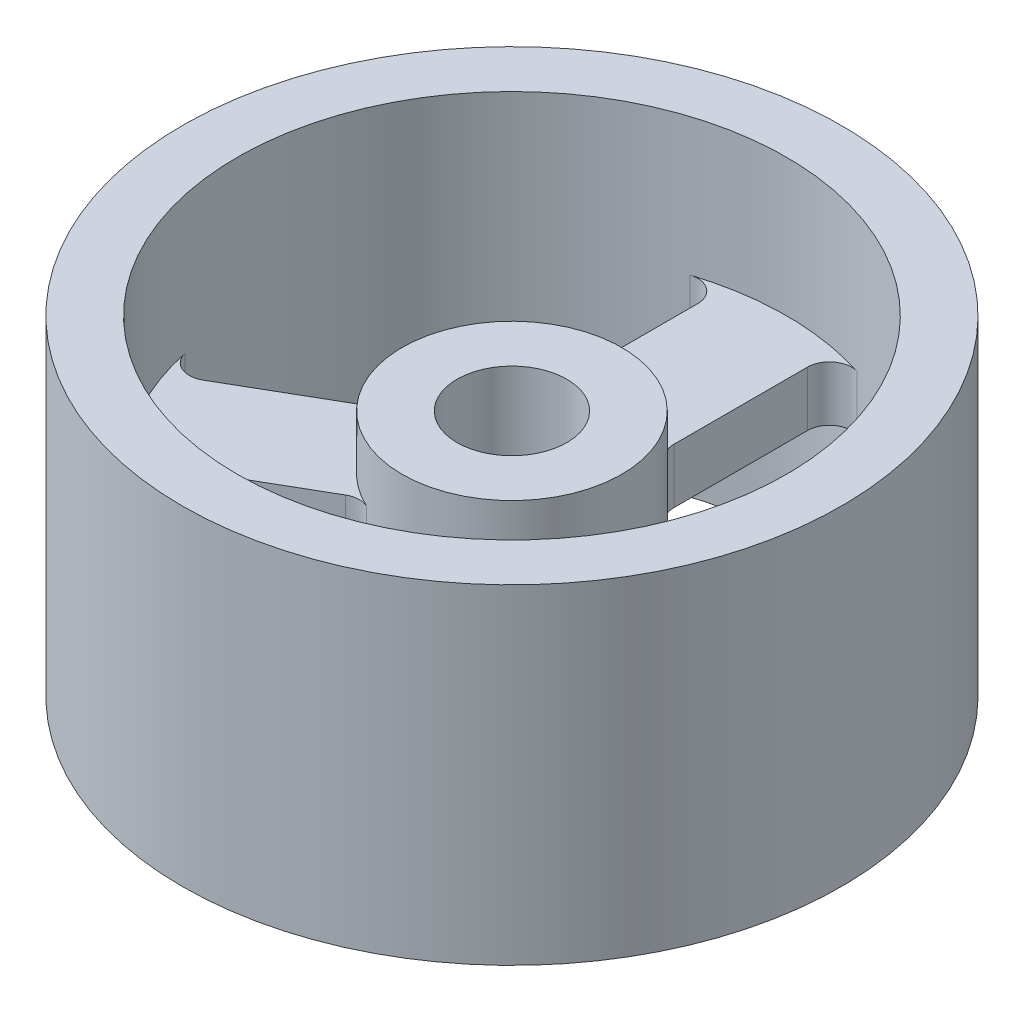
ISO-10303-21;
HEADER;
FILE_DESCRIPTION(('STEP AP214'),'2;1');
FILE_NAME('part.step','',(''),(''),'','','');
FILE_SCHEMA(('AUTOMOTIVE_DESIGN { 1 0 10303 214 1 1 1 1 }'));
ENDSEC;
DATA;
#1=APPLICATION_CONTEXT('core data for automotive mechanical design processes');
#2=APPLICATION_PROTOCOL_DEFINITION('international standard','automotive_design',2000,#1);
#3=PRODUCT_CONTEXT('',#1,'mechanical');
#4=PRODUCT('Part','Part','',(#3));
#5=PRODUCT_RELATED_PRODUCT_CATEGORY('part','',(#4));
#6=PRODUCT_DEFINITION_FORMATION('','',#4);
#7=PRODUCT_DEFINITION_CONTEXT('part definition',#1,'design');
#8=PRODUCT_DEFINITION('design','',#6,#7);
#9=PRODUCT_DEFINITION_SHAPE('','',#8);
#10=(LENGTH_UNIT() NAMED_UNIT(*) SI_UNIT(.MILLI.,.METRE.));
#11=(NAMED_UNIT(*) PLANE_ANGLE_UNIT() SI_UNIT($,.RADIAN.));
#12=(NAMED_UNIT(*) SI_UNIT($,.STERADIAN.) SOLID_ANGLE_UNIT());
#13=UNCERTAINTY_MEASURE_WITH_UNIT(LENGTH_MEASURE(1.E-05),#10,'distance_accuracy_value','');
#14=(GEOMETRIC_REPRESENTATION_CONTEXT(3) GLOBAL_UNCERTAINTY_ASSIGNED_CONTEXT((#13)) GLOBAL_UNIT_ASSIGNED_CONTEXT((#10,
#11,#12)) REPRESENTATION_CONTEXT('',''));
#15=CARTESIAN_POINT('',(0.,0.,0.));
#16=DIRECTION('',(0.,0.,1.));
#17=DIRECTION('',(1.,0.,0.));
#18=AXIS2_PLACEMENT_3D('',#15,#16,#17);
#19=CARTESIAN_POINT('',(0.,15.,0.));
#20=DIRECTION('',(0.,-1.,0.));
#21=DIRECTION('',(0.,0.,-1.));
#22=AXIS2_PLACEMENT_3D('',#19,#20,#21);
#23=CYLINDRICAL_SURFACE('',#22,25.);
#24=CARTESIAN_POINT('',(0.,2.5,0.));
#25=DIRECTION('',(0.,1.,0.));
#26=DIRECTION('',(0.,0.,1.));
#27=AXIS2_PLACEMENT_3D('',#24,#25,#26);
#28=CIRCLE('',#27,25.);
#29=CARTESIAN_POINT('',(-24.4278977837068,2.5,5.3176883952307));
#30=VERTEX_POINT('',#29);
#31=CARTESIAN_POINT('',(-16.819202131533,2.5,18.4963358441243));
#32=VERTEX_POINT('',#31);
#33=EDGE_CURVE('E236',#30,#32,#28,.T.);
#34=ORIENTED_EDGE('',*,*,#33,.F.);
#35=DIRECTION('',(0.,-1.,0.));
#36=VECTOR('',#35,1.);
#37=CARTESIAN_POINT('',(-24.4278977837068,2.5,5.3176883952307));
#38=LINE('',#37,#36);
#39=CARTESIAN_POINT('',(-24.4278977837068,-2.5,5.3176883952307));
#40=VERTEX_POINT('',#39);
#41=EDGE_CURVE('E269',#30,#40,#38,.T.);
#42=ORIENTED_EDGE('',*,*,#41,.T.);
#43=CARTESIAN_POINT('',(0.,-2.5,0.));
#44=DIRECTION('',(0.,1.,0.));
#45=DIRECTION('',(0.,0.,1.));
#46=AXIS2_PLACEMENT_3D('',#43,#44,#45);
#47=CIRCLE('',#46,25.);
#48=CARTESIAN_POINT('',(-16.819202131533,-2.5,18.4963358441243));
#49=VERTEX_POINT('',#48);
#50=EDGE_CURVE('E252',#40,#49,#47,.T.);
#51=ORIENTED_EDGE('',*,*,#50,.T.);
#52=DIRECTION('',(0.,-1.,0.));
#53=VECTOR('',#52,1.);
#54=CARTESIAN_POINT('',(-16.819202131533,2.5,18.4963358441243));
#55=LINE('',#54,#53);
#56=EDGE_CURVE('E267',#32,#49,#55,.T.);
#57=ORIENTED_EDGE('',*,*,#56,.F.);
#58=EDGE_LOOP('',(#34,#42,#51,#57));
#59=FACE_BOUND('',#58,.T.);
#60=CARTESIAN_POINT('',(0.,2.5,0.));
#61=DIRECTION('',(0.,1.,0.));
#62=DIRECTION('',(0.,0.,1.));
#63=AXIS2_PLACEMENT_3D('',#60,#61,#62);
#64=CIRCLE('',#63,25.);
#65=CARTESIAN_POINT('',(16.819202131533,2.5,18.4963358441243));
#66=VERTEX_POINT('',#65);
#67=CARTESIAN_POINT('',(24.4278977837068,2.5,5.3176883952307));
#68=VERTEX_POINT('',#67);
#69=EDGE_CURVE('E290',#66,#68,#64,.T.);
#70=ORIENTED_EDGE('',*,*,#69,.F.);
#71=DIRECTION('',(0.,-1.,0.));
#72=VECTOR('',#71,1.);
#73=CARTESIAN_POINT('',(16.819202131533,2.5,18.4963358441243));
#74=LINE('',#73,#72);
#75=CARTESIAN_POINT('',(16.819202131533,-2.5,18.4963358441243));
#76=VERTEX_POINT('',#75);
#77=EDGE_CURVE('E321',#66,#76,#74,.T.);
#78=ORIENTED_EDGE('',*,*,#77,.T.);
#79=CARTESIAN_POINT('',(0.,-2.5,0.));
#80=DIRECTION('',(0.,1.,0.));
#81=DIRECTION('',(0.,0.,1.));
#82=AXIS2_PLACEMENT_3D('',#79,#80,#81);
#83=CIRCLE('',#82,25.);
#84=CARTESIAN_POINT('',(24.4278977837068,-2.5,5.3176883952307));
#85=VERTEX_POINT('',#84);
#86=EDGE_CURVE('E312',#76,#85,#83,.T.);
#87=ORIENTED_EDGE('',*,*,#86,.T.);
#88=DIRECTION('',(0.,-1.,0.));
#89=VECTOR('',#88,1.);
#90=CARTESIAN_POINT('',(24.4278977837068,2.5,5.3176883952307));
#91=LINE('',#90,#89);
#92=EDGE_CURVE('E318',#68,#85,#91,.T.);
#93=ORIENTED_EDGE('',*,*,#92,.F.);
#94=EDGE_LOOP('',(#70,#78,#87,#93));
#95=FACE_BOUND('',#94,.T.);
#96=CARTESIAN_POINT('',(0.,2.5,0.));
#97=DIRECTION('',(0.,1.,0.));
#98=DIRECTION('',(0.,0.,1.));
#99=AXIS2_PLACEMENT_3D('',#96,#97,#98);
#100=CIRCLE('',#99,25.);
#101=CARTESIAN_POINT('',(7.60869565217404,2.5,-23.814024239355));
#102=VERTEX_POINT('',#101);
#103=CARTESIAN_POINT('',(-7.6086956521737,2.5,-23.8140242393551));
#104=VERTEX_POINT('',#103);
#105=EDGE_CURVE('E357',#102,#104,#100,.T.);
#106=ORIENTED_EDGE('',*,*,#105,.F.);
#107=DIRECTION('',(0.,-1.,0.));
#108=VECTOR('',#107,1.);
#109=CARTESIAN_POINT('',(7.60869565217404,2.5,-23.814024239355));
#110=LINE('',#109,#108);
#111=CARTESIAN_POINT('',(7.60869565217404,-2.5,-23.814024239355));
#112=VERTEX_POINT('',#111);
#113=EDGE_CURVE('E403',#102,#112,#110,.T.);
#114=ORIENTED_EDGE('',*,*,#113,.T.);
#115=CARTESIAN_POINT('',(0.,-2.5,0.));
#116=DIRECTION('',(0.,1.,0.));
#117=DIRECTION('',(0.,0.,1.));
#118=AXIS2_PLACEMENT_3D('',#115,#116,#117);
#119=CIRCLE('',#118,25.);
#120=CARTESIAN_POINT('',(-7.6086956521737,-2.5,-23.8140242393551));
#121=VERTEX_POINT('',#120);
#122=EDGE_CURVE('E378',#112,#121,#119,.T.);
#123=ORIENTED_EDGE('',*,*,#122,.T.);
#124=DIRECTION('',(0.,-1.,0.));
#125=VECTOR('',#124,1.);
#126=CARTESIAN_POINT('',(-7.6086956521737,2.5,-23.8140242393551));
#127=LINE('',#126,#125);
#128=EDGE_CURVE('E400',#104,#121,#127,.T.);
#129=ORIENTED_EDGE('',*,*,#128,.F.);
#130=EDGE_LOOP('',(#106,#114,#123,#129));
#131=FACE_BOUND('',#130,.T.);
#132=CARTESIAN_POINT('',(0.,15.,0.));
#133=DIRECTION('',(0.,1.,0.));
#134=DIRECTION('',(0.,0.,1.));
#135=AXIS2_PLACEMENT_3D('',#132,#133,#134);
#136=CIRCLE('',#135,25.);
#137=CARTESIAN_POINT('',(0.,15.,25.));
#138=VERTEX_POINT('',#137);
#139=EDGE_CURVE('E50',#138,#138,#136,.T.);
#140=ORIENTED_EDGE('',*,*,#139,.T.);
#141=EDGE_LOOP('',(#140));
#142=FACE_BOUND('',#141,.T.);
#143=CARTESIAN_POINT('',(0.,-15.,0.));
#144=DIRECTION('',(0.,1.,0.));
#145=DIRECTION('',(0.,0.,1.));
#146=AXIS2_PLACEMENT_3D('',#143,#144,#145);
#147=CIRCLE('',#146,25.);
#148=CARTESIAN_POINT('',(0.,-15.,25.));
#149=VERTEX_POINT('',#148);
#150=EDGE_CURVE('E410',#149,#149,#147,.T.);
#151=ORIENTED_EDGE('',*,*,#150,.F.);
#152=EDGE_LOOP('',(#151));
#153=FACE_BOUND('',#152,.T.);
#154=ADVANCED_FACE('F42',(#59,#95,#131,#142,#153),#23,.F.);
#155=CARTESIAN_POINT('',(0.,15.,0.));
#156=DIRECTION('',(0.,-1.,0.));
#157=DIRECTION('',(0.,0.,-1.));
#158=AXIS2_PLACEMENT_3D('',#155,#156,#157);
#159=CYLINDRICAL_SURFACE('',#158,30.);
#160=CARTESIAN_POINT('',(0.,15.,0.));
#161=DIRECTION('',(0.,1.,0.));
#162=DIRECTION('',(0.,0.,1.));
#163=AXIS2_PLACEMENT_3D('',#160,#161,#162);
#164=CIRCLE('',#163,30.);
#165=CARTESIAN_POINT('',(0.,15.,30.));
#166=VERTEX_POINT('',#165);
#167=EDGE_CURVE('E11',#166,#166,#164,.T.);
#168=ORIENTED_EDGE('',*,*,#167,.F.);
#169=EDGE_LOOP('',(#168));
#170=FACE_BOUND('',#169,.T.);
#171=CARTESIAN_POINT('',(0.,-15.,0.));
#172=DIRECTION('',(0.,1.,0.));
#173=DIRECTION('',(0.,0.,1.));
#174=AXIS2_PLACEMENT_3D('',#171,#172,#173);
#175=CIRCLE('',#174,30.);
#176=CARTESIAN_POINT('',(0.,-15.,30.));
#177=VERTEX_POINT('',#176);
#178=EDGE_CURVE('E45',#177,#177,#175,.T.);
#179=ORIENTED_EDGE('',*,*,#178,.T.);
#180=EDGE_LOOP('',(#179));
#181=FACE_BOUND('',#180,.T.);
#182=ADVANCED_FACE('F418',(#170,#181),#159,.T.);
#183=CARTESIAN_POINT('',(0.,15.,0.));
#184=DIRECTION('',(0.,1.,0.));
#185=DIRECTION('',(0.,0.,1.));
#186=AXIS2_PLACEMENT_3D('',#183,#184,#185);
#187=PLANE('',#186);
#188=ORIENTED_EDGE('',*,*,#139,.F.);
#189=EDGE_LOOP('',(#188));
#190=FACE_BOUND('',#189,.T.);
#191=ORIENTED_EDGE('',*,*,#167,.T.);
#192=EDGE_LOOP('',(#191));
#193=FACE_BOUND('',#192,.T.);
#194=ADVANCED_FACE('F423',(#190,#193),#187,.T.);
#195=CARTESIAN_POINT('',(0.,-15.,0.));
#196=DIRECTION('',(0.,1.,0.));
#197=DIRECTION('',(0.,0.,1.));
#198=AXIS2_PLACEMENT_3D('',#195,#196,#197);
#199=PLANE('',#198);
#200=ORIENTED_EDGE('',*,*,#150,.T.);
#201=EDGE_LOOP('',(#200));
#202=FACE_BOUND('',#201,.T.);
#203=ORIENTED_EDGE('',*,*,#178,.F.);
#204=EDGE_LOOP('',(#203));
#205=FACE_BOUND('',#204,.T.);
#206=ADVANCED_FACE('F420',(#202,#205),#199,.F.);
#207=CARTESIAN_POINT('',(7.00000000000003,2.5,-9.74679434480895));
#208=DIRECTION('',(0.,-1.,0.));
#209=DIRECTION('',(0.,0.,-1.));
#210=AXIS2_PLACEMENT_3D('',#207,#208,#209);
#211=CYLINDRICAL_SURFACE('',#210,2.);
#212=CARTESIAN_POINT('',(7.00000000000003,-2.5,-9.74679434480895));
#213=DIRECTION('',(0.,1.,0.));
#214=DIRECTION('',(0.,0.,1.));
#215=AXIS2_PLACEMENT_3D('',#212,#213,#214);
#216=CIRCLE('',#215,2.);
#217=CARTESIAN_POINT('',(5.00000000000003,-2.5,-9.74679434480896));
#218=VERTEX_POINT('',#217);
#219=CARTESIAN_POINT('',(5.83333333333336,-2.5,-8.12232862067412));
#220=VERTEX_POINT('',#219);
#221=EDGE_CURVE('E343',#218,#220,#216,.T.);
#222=ORIENTED_EDGE('',*,*,#221,.F.);
#223=DIRECTION('',(0.,-1.,0.));
#224=VECTOR('',#223,1.);
#225=CARTESIAN_POINT('',(5.00000000000003,2.5,-9.74679434480896));
#226=LINE('',#225,#224);
#227=CARTESIAN_POINT('',(5.00000000000003,2.5,-9.74679434480896));
#228=VERTEX_POINT('',#227);
#229=EDGE_CURVE('E408',#228,#218,#226,.T.);
#230=ORIENTED_EDGE('',*,*,#229,.F.);
#231=CARTESIAN_POINT('',(7.00000000000003,2.5,-9.74679434480895));
#232=DIRECTION('',(0.,1.,0.));
#233=DIRECTION('',(0.,0.,1.));
#234=AXIS2_PLACEMENT_3D('',#231,#232,#233);
#235=CIRCLE('',#234,2.);
#236=CARTESIAN_POINT('',(5.83333333333336,2.5,-8.12232862067412));
#237=VERTEX_POINT('',#236);
#238=EDGE_CURVE('E348',#228,#237,#235,.T.);
#239=ORIENTED_EDGE('',*,*,#238,.T.);
#240=DIRECTION('',(0.,-1.,0.));
#241=VECTOR('',#240,1.);
#242=CARTESIAN_POINT('',(5.83333333333336,2.5,-8.12232862067412));
#243=LINE('',#242,#241);
#244=EDGE_CURVE('E369',#237,#220,#243,.T.);
#245=ORIENTED_EDGE('',*,*,#244,.T.);
#246=EDGE_LOOP('',(#222,#230,#239,#245));
#247=FACE_BOUND('',#246,.T.);
#248=ADVANCED_FACE('F422',(#247),#211,.F.);
#249=CARTESIAN_POINT('',(4.99999999999996,2.5,0.));
#250=DIRECTION('',(-1.,0.,0.));
#251=DIRECTION('',(0.,0.,1.));
#252=AXIS2_PLACEMENT_3D('',#249,#250,#251);
#253=PLANE('',#252);
#254=DIRECTION('',(0.,0.,-1.));
#255=VECTOR('',#254,1.);
#256=CARTESIAN_POINT('',(4.99999999999996,-2.5,0.));
#257=LINE('',#256,#255);
#258=CARTESIAN_POINT('',(5.00000000000011,-2.5,-21.9089023002066));
#259=VERTEX_POINT('',#258);
#260=EDGE_CURVE('E372',#218,#259,#257,.T.);
#261=ORIENTED_EDGE('',*,*,#260,.T.);
#262=DIRECTION('',(0.,-1.,0.));
#263=VECTOR('',#262,1.);
#264=CARTESIAN_POINT('',(5.00000000000011,2.5,-21.9089023002066));
#265=LINE('',#264,#263);
#266=CARTESIAN_POINT('',(5.00000000000011,2.5,-21.9089023002066));
#267=VERTEX_POINT('',#266);
#268=EDGE_CURVE('E406',#267,#259,#265,.T.);
#269=ORIENTED_EDGE('',*,*,#268,.F.);
#270=DIRECTION('',(0.,0.,-1.));
#271=VECTOR('',#270,1.);
#272=CARTESIAN_POINT('',(4.99999999999996,2.5,0.));
#273=LINE('',#272,#271);
#274=EDGE_CURVE('E351',#228,#267,#273,.T.);
#275=ORIENTED_EDGE('',*,*,#274,.F.);
#276=ORIENTED_EDGE('',*,*,#229,.T.);
#277=EDGE_LOOP('',(#261,#269,#275,#276));
#278=FACE_BOUND('',#277,.T.);
#279=ADVANCED_FACE('F429',(#278),#253,.F.);
#280=CARTESIAN_POINT('',(7.00000000000011,2.5,-21.9089023002066));
#281=DIRECTION('',(0.,-1.,0.));
#282=DIRECTION('',(0.,0.,-1.));
#283=AXIS2_PLACEMENT_3D('',#280,#281,#282);
#284=CYLINDRICAL_SURFACE('',#283,2.00000000000001);
#285=CARTESIAN_POINT('',(7.00000000000011,-2.5,-21.9089023002066));
#286=DIRECTION('',(0.,1.,0.));
#287=DIRECTION('',(0.,0.,1.));
#288=AXIS2_PLACEMENT_3D('',#285,#286,#287);
#289=CIRCLE('',#288,2.00000000000001);
#290=EDGE_CURVE('E375',#112,#259,#289,.T.);
#291=ORIENTED_EDGE('',*,*,#290,.F.);
#292=ORIENTED_EDGE('',*,*,#113,.F.);
#293=CARTESIAN_POINT('',(7.00000000000011,2.5,-21.9089023002066));
#294=DIRECTION('',(0.,1.,0.));
#295=DIRECTION('',(0.,0.,1.));
#296=AXIS2_PLACEMENT_3D('',#293,#294,#295);
#297=CIRCLE('',#296,2.00000000000001);
#298=EDGE_CURVE('E354',#102,#267,#297,.T.);
#299=ORIENTED_EDGE('',*,*,#298,.T.);
#300=ORIENTED_EDGE('',*,*,#268,.T.);
#301=EDGE_LOOP('',(#291,#292,#299,#300));
#302=FACE_BOUND('',#301,.T.);
#303=ADVANCED_FACE('F481',(#302),#284,.F.);
#304=CARTESIAN_POINT('',(-6.9999999999998,2.5,-21.9089023002067));
#305=DIRECTION('',(0.,-1.,0.));
#306=DIRECTION('',(0.,0.,-1.));
#307=AXIS2_PLACEMENT_3D('',#304,#305,#306);
#308=CYLINDRICAL_SURFACE('',#307,2.);
#309=CARTESIAN_POINT('',(-6.9999999999998,-2.5,-21.9089023002067));
#310=DIRECTION('',(0.,1.,0.));
#311=DIRECTION('',(0.,0.,1.));
#312=AXIS2_PLACEMENT_3D('',#309,#310,#311);
#313=CIRCLE('',#312,2.);
#314=CARTESIAN_POINT('',(-4.99999999999981,-2.5,-21.9089023002067));
#315=VERTEX_POINT('',#314);
#316=EDGE_CURVE('E381',#121,#315,#313,.F.);
#317=ORIENTED_EDGE('',*,*,#316,.T.);
#318=DIRECTION('',(0.,-1.,0.));
#319=VECTOR('',#318,1.);
#320=CARTESIAN_POINT('',(-4.99999999999981,2.5,-21.9089023002067));
#321=LINE('',#320,#319);
#322=CARTESIAN_POINT('',(-4.99999999999981,2.5,-21.9089023002067));
#323=VERTEX_POINT('',#322);
#324=EDGE_CURVE('E398',#323,#315,#321,.T.);
#325=ORIENTED_EDGE('',*,*,#324,.F.);
#326=CARTESIAN_POINT('',(-6.9999999999998,2.5,-21.9089023002067));
#327=DIRECTION('',(0.,1.,0.));
#328=DIRECTION('',(0.,0.,1.));
#329=AXIS2_PLACEMENT_3D('',#326,#327,#328);
#330=CIRCLE('',#329,2.);
#331=EDGE_CURVE('E359',#104,#323,#330,.F.);
#332=ORIENTED_EDGE('',*,*,#331,.F.);
#333=ORIENTED_EDGE('',*,*,#128,.T.);
#334=EDGE_LOOP('',(#317,#325,#332,#333));
#335=FACE_BOUND('',#334,.T.);
#336=ADVANCED_FACE('F461',(#335),#308,.F.);
#337=CARTESIAN_POINT('',(-4.99999999999998,2.5,0.));
#338=DIRECTION('',(-1.,0.,0.));
#339=DIRECTION('',(0.,0.,1.));
#340=AXIS2_PLACEMENT_3D('',#337,#338,#339);
#341=PLANE('',#340);
#342=DIRECTION('',(0.,0.,-1.));
#343=VECTOR('',#342,1.);
#344=CARTESIAN_POINT('',(-4.99999999999998,-2.5,0.));
#345=LINE('',#344,#343);
#346=CARTESIAN_POINT('',(-4.9999999999999,-2.5,-9.74679434480902));
#347=VERTEX_POINT('',#346);
#348=EDGE_CURVE('E384',#347,#315,#345,.T.);
#349=ORIENTED_EDGE('',*,*,#348,.F.);
#350=DIRECTION('',(0.,-1.,0.));
#351=VECTOR('',#350,1.);
#352=CARTESIAN_POINT('',(-4.9999999999999,2.5,-9.74679434480902));
#353=LINE('',#352,#351);
#354=CARTESIAN_POINT('',(-4.9999999999999,2.5,-9.74679434480902));
#355=VERTEX_POINT('',#354);
#356=EDGE_CURVE('E396',#355,#347,#353,.T.);
#357=ORIENTED_EDGE('',*,*,#356,.F.);
#358=DIRECTION('',(0.,0.,-1.));
#359=VECTOR('',#358,1.);
#360=CARTESIAN_POINT('',(-4.99999999999998,2.5,0.));
#361=LINE('',#360,#359);
#362=EDGE_CURVE('E361',#355,#323,#361,.T.);
#363=ORIENTED_EDGE('',*,*,#362,.T.);
#364=ORIENTED_EDGE('',*,*,#324,.T.);
#365=EDGE_LOOP('',(#349,#357,#363,#364));
#366=FACE_BOUND('',#365,.T.);
#367=ADVANCED_FACE('F464',(#366),#341,.T.);
#368=CARTESIAN_POINT('',(-6.99999999999989,2.5,-9.74679434480904));
#369=DIRECTION('',(0.,-1.,0.));
#370=DIRECTION('',(0.,0.,-1.));
#371=AXIS2_PLACEMENT_3D('',#368,#369,#370);
#372=CYLINDRICAL_SURFACE('',#371,1.99999999999999);
#373=CARTESIAN_POINT('',(-6.99999999999989,-2.5,-9.74679434480904));
#374=DIRECTION('',(0.,1.,0.));
#375=DIRECTION('',(0.,0.,1.));
#376=AXIS2_PLACEMENT_3D('',#373,#374,#375);
#377=CIRCLE('',#376,1.99999999999999);
#378=CARTESIAN_POINT('',(-5.83333333333324,-2.5,-8.12232862067421));
#379=VERTEX_POINT('',#378);
#380=EDGE_CURVE('E387',#347,#379,#377,.F.);
#381=ORIENTED_EDGE('',*,*,#380,.T.);
#382=DIRECTION('',(0.,-1.,0.));
#383=VECTOR('',#382,1.);
#384=CARTESIAN_POINT('',(-5.83333333333324,2.5,-8.12232862067421));
#385=LINE('',#384,#383);
#386=CARTESIAN_POINT('',(-5.83333333333324,2.5,-8.1223286206742));
#387=VERTEX_POINT('',#386);
#388=EDGE_CURVE('E394',#387,#379,#385,.T.);
#389=ORIENTED_EDGE('',*,*,#388,.F.);
#390=CARTESIAN_POINT('',(-6.99999999999989,2.5,-9.74679434480904));
#391=DIRECTION('',(0.,1.,0.));
#392=DIRECTION('',(0.,0.,1.));
#393=AXIS2_PLACEMENT_3D('',#390,#391,#392);
#394=CIRCLE('',#393,1.99999999999999);
#395=EDGE_CURVE('E364',#355,#387,#394,.F.);
#396=ORIENTED_EDGE('',*,*,#395,.F.);
#397=ORIENTED_EDGE('',*,*,#356,.T.);
#398=EDGE_LOOP('',(#381,#389,#396,#397));
#399=FACE_BOUND('',#398,.T.);
#400=ADVANCED_FACE('F469',(#399),#372,.F.);
#401=CARTESIAN_POINT('',(0.,2.5,0.));
#402=DIRECTION('',(0.,1.,0.));
#403=DIRECTION('',(0.,0.,1.));
#404=AXIS2_PLACEMENT_3D('',#401,#402,#403);
#405=PLANE('',#404);
#406=ORIENTED_EDGE('',*,*,#238,.F.);
#407=ORIENTED_EDGE('',*,*,#274,.T.);
#408=ORIENTED_EDGE('',*,*,#298,.F.);
#409=ORIENTED_EDGE('',*,*,#105,.T.);
#410=ORIENTED_EDGE('',*,*,#331,.T.);
#411=ORIENTED_EDGE('',*,*,#362,.F.);
#412=ORIENTED_EDGE('',*,*,#395,.T.);
#413=CARTESIAN_POINT('',(0.,2.5,0.));
#414=DIRECTION('',(0.,1.,0.));
#415=DIRECTION('',(0.,0.,1.));
#416=AXIS2_PLACEMENT_3D('',#413,#414,#415);
#417=CIRCLE('',#416,10.);
#418=EDGE_CURVE('E367',#237,#387,#417,.T.);
#419=ORIENTED_EDGE('',*,*,#418,.F.);
#420=EDGE_LOOP('',(#406,#407,#408,#409,#410,#411,#412,#419));
#421=FACE_BOUND('',#420,.T.);
#422=ADVANCED_FACE('F457',(#421),#405,.T.);
#423=CARTESIAN_POINT('',(0.,-2.5,0.));
#424=DIRECTION('',(0.,1.,0.));
#425=DIRECTION('',(0.,0.,1.));
#426=AXIS2_PLACEMENT_3D('',#423,#424,#425);
#427=PLANE('',#426);
#428=ORIENTED_EDGE('',*,*,#221,.T.);
#429=CARTESIAN_POINT('',(0.,-2.5,0.));
#430=DIRECTION('',(0.,1.,0.));
#431=DIRECTION('',(0.,0.,1.));
#432=AXIS2_PLACEMENT_3D('',#429,#430,#431);
#433=CIRCLE('',#432,10.);
#434=EDGE_CURVE('E352',#220,#379,#433,.T.);
#435=ORIENTED_EDGE('',*,*,#434,.T.);
#436=ORIENTED_EDGE('',*,*,#380,.F.);
#437=ORIENTED_EDGE('',*,*,#348,.T.);
#438=ORIENTED_EDGE('',*,*,#316,.F.);
#439=ORIENTED_EDGE('',*,*,#122,.F.);
#440=ORIENTED_EDGE('',*,*,#290,.T.);
#441=ORIENTED_EDGE('',*,*,#260,.F.);
#442=EDGE_LOOP('',(#428,#435,#436,#437,#438,#439,#440,#441));
#443=FACE_BOUND('',#442,.T.);
#444=ADVANCED_FACE('F483',(#443),#427,.F.);
#445=CARTESIAN_POINT('',(0.,7.5,0.));
#446=DIRECTION('',(0.,-1.,0.));
#447=DIRECTION('',(0.,0.,-1.));
#448=AXIS2_PLACEMENT_3D('',#445,#446,#447);
#449=CYLINDRICAL_SURFACE('',#448,5.);
#450=CARTESIAN_POINT('',(0.,7.5,0.));
#451=DIRECTION('',(0.,1.,0.));
#452=DIRECTION('',(0.,0.,1.));
#453=AXIS2_PLACEMENT_3D('',#450,#451,#452);
#454=CIRCLE('',#453,5.);
#455=CARTESIAN_POINT('',(0.,7.5,5.));
#456=VERTEX_POINT('',#455);
#457=EDGE_CURVE('E336',#456,#456,#454,.T.);
#458=ORIENTED_EDGE('',*,*,#457,.T.);
#459=EDGE_LOOP('',(#458));
#460=FACE_BOUND('',#459,.T.);
#461=CARTESIAN_POINT('',(0.,-7.5,0.));
#462=DIRECTION('',(0.,1.,0.));
#463=DIRECTION('',(0.,0.,1.));
#464=AXIS2_PLACEMENT_3D('',#461,#462,#463);
#465=CIRCLE('',#464,5.);
#466=CARTESIAN_POINT('',(0.,-7.5,5.));
#467=VERTEX_POINT('',#466);
#468=EDGE_CURVE('E335',#467,#467,#465,.T.);
#469=ORIENTED_EDGE('',*,*,#468,.F.);
#470=EDGE_LOOP('',(#469));
#471=FACE_BOUND('',#470,.T.);
#472=ADVANCED_FACE('F485',(#460,#471),#449,.F.);
#473=CARTESIAN_POINT('',(0.,7.5,0.));
#474=DIRECTION('',(0.,-1.,0.));
#475=DIRECTION('',(0.,0.,-1.));
#476=AXIS2_PLACEMENT_3D('',#473,#474,#475);
#477=CYLINDRICAL_SURFACE('',#476,10.);
#478=DIRECTION('',(0.,-1.,0.));
#479=VECTOR('',#478,1.);
#480=CARTESIAN_POINT('',(-9.95080959005589,2.5,-0.99065054507214));
#481=LINE('',#480,#479);
#482=CARTESIAN_POINT('',(-9.95080959005589,2.5,-0.99065054507214));
#483=VERTEX_POINT('',#482);
#484=CARTESIAN_POINT('',(-9.95080959005589,-2.5,-0.99065054507214));
#485=VERTEX_POINT('',#484);
#486=EDGE_CURVE('E66',#483,#485,#481,.T.);
#487=ORIENTED_EDGE('',*,*,#486,.F.);
#488=CARTESIAN_POINT('',(0.,2.5,0.));
#489=DIRECTION('',(0.,1.,0.));
#490=DIRECTION('',(0.,0.,1.));
#491=AXIS2_PLACEMENT_3D('',#488,#489,#490);
#492=CIRCLE('',#491,10.);
#493=CARTESIAN_POINT('',(-4.11747625672262,2.5,9.11297916574627));
#494=VERTEX_POINT('',#493);
#495=EDGE_CURVE('E228',#483,#494,#492,.T.);
#496=ORIENTED_EDGE('',*,*,#495,.T.);
#497=DIRECTION('',(0.,-1.,0.));
#498=VECTOR('',#497,1.);
#499=CARTESIAN_POINT('',(-4.11747625672262,2.5,9.11297916574627));
#500=LINE('',#499,#498);
#501=CARTESIAN_POINT('',(-4.11747625672262,-2.5,9.11297916574627));
#502=VERTEX_POINT('',#501);
#503=EDGE_CURVE('E261',#494,#502,#500,.T.);
#504=ORIENTED_EDGE('',*,*,#503,.T.);
#505=CARTESIAN_POINT('',(0.,-2.5,0.));
#506=DIRECTION('',(0.,1.,0.));
#507=DIRECTION('',(0.,0.,1.));
#508=AXIS2_PLACEMENT_3D('',#505,#506,#507);
#509=CIRCLE('',#508,10.);
#510=EDGE_CURVE('E229',#485,#502,#509,.T.);
#511=ORIENTED_EDGE('',*,*,#510,.F.);
#512=EDGE_LOOP('',(#487,#496,#504,#511));
#513=FACE_BOUND('',#512,.T.);
#514=DIRECTION('',(0.,-1.,0.));
#515=VECTOR('',#514,1.);
#516=CARTESIAN_POINT('',(4.11747625672261,2.5,9.11297916574627));
#517=LINE('',#516,#515);
#518=CARTESIAN_POINT('',(4.11747625672261,2.5,9.11297916574627));
#519=VERTEX_POINT('',#518);
#520=CARTESIAN_POINT('',(4.11747625672261,-2.5,9.11297916574627));
#521=VERTEX_POINT('',#520);
#522=EDGE_CURVE('E328',#519,#521,#517,.T.);
#523=ORIENTED_EDGE('',*,*,#522,.F.);
#524=CARTESIAN_POINT('',(0.,2.5,0.));
#525=DIRECTION('',(0.,1.,0.));
#526=DIRECTION('',(0.,0.,1.));
#527=AXIS2_PLACEMENT_3D('',#524,#525,#526);
#528=CIRCLE('',#527,10.);
#529=CARTESIAN_POINT('',(9.9508095900559,2.5,-0.990650545072136));
#530=VERTEX_POINT('',#529);
#531=EDGE_CURVE('E280',#519,#530,#528,.T.);
#532=ORIENTED_EDGE('',*,*,#531,.T.);
#533=DIRECTION('',(0.,-1.,0.));
#534=VECTOR('',#533,1.);
#535=CARTESIAN_POINT('',(9.9508095900559,2.5,-0.990650545072136));
#536=LINE('',#535,#534);
#537=CARTESIAN_POINT('',(9.9508095900559,-2.5,-0.990650545072136));
#538=VERTEX_POINT('',#537);
#539=EDGE_CURVE('E331',#530,#538,#536,.T.);
#540=ORIENTED_EDGE('',*,*,#539,.T.);
#541=CARTESIAN_POINT('',(0.,-2.5,0.));
#542=DIRECTION('',(0.,1.,0.));
#543=DIRECTION('',(0.,0.,1.));
#544=AXIS2_PLACEMENT_3D('',#541,#542,#543);
#545=CIRCLE('',#544,10.);
#546=EDGE_CURVE('E300',#521,#538,#545,.T.);
#547=ORIENTED_EDGE('',*,*,#546,.F.);
#548=EDGE_LOOP('',(#523,#532,#540,#547));
#549=FACE_BOUND('',#548,.T.);
#550=ORIENTED_EDGE('',*,*,#418,.T.);
#551=ORIENTED_EDGE('',*,*,#388,.T.);
#552=ORIENTED_EDGE('',*,*,#434,.F.);
#553=ORIENTED_EDGE('',*,*,#244,.F.);
#554=EDGE_LOOP('',(#550,#551,#552,#553));
#555=FACE_BOUND('',#554,.T.);
#556=CARTESIAN_POINT('',(0.,7.5,0.));
#557=DIRECTION('',(0.,1.,0.));
#558=DIRECTION('',(0.,0.,1.));
#559=AXIS2_PLACEMENT_3D('',#556,#557,#558);
#560=CIRCLE('',#559,10.);
#561=CARTESIAN_POINT('',(0.,7.5,10.));
#562=VERTEX_POINT('',#561);
#563=EDGE_CURVE('E339',#562,#562,#560,.T.);
#564=ORIENTED_EDGE('',*,*,#563,.F.);
#565=EDGE_LOOP('',(#564));
#566=FACE_BOUND('',#565,.T.);
#567=CARTESIAN_POINT('',(0.,-7.5,0.));
#568=DIRECTION('',(0.,1.,0.));
#569=DIRECTION('',(0.,0.,1.));
#570=AXIS2_PLACEMENT_3D('',#567,#568,#569);
#571=CIRCLE('',#570,10.);
#572=CARTESIAN_POINT('',(0.,-7.5,10.));
#573=VERTEX_POINT('',#572);
#574=EDGE_CURVE('E340',#573,#573,#571,.T.);
#575=ORIENTED_EDGE('',*,*,#574,.T.);
#576=EDGE_LOOP('',(#575));
#577=FACE_BOUND('',#576,.T.);
#578=ADVANCED_FACE('F472',(#513,#549,#555,#566,#577),#477,.T.);
#579=CARTESIAN_POINT('',(0.,7.5,0.));
#580=DIRECTION('',(0.,1.,0.));
#581=DIRECTION('',(0.,0.,1.));
#582=AXIS2_PLACEMENT_3D('',#579,#580,#581);
#583=PLANE('',#582);
#584=ORIENTED_EDGE('',*,*,#457,.F.);
#585=EDGE_LOOP('',(#584));
#586=FACE_BOUND('',#585,.T.);
#587=ORIENTED_EDGE('',*,*,#563,.T.);
#588=EDGE_LOOP('',(#587));
#589=FACE_BOUND('',#588,.T.);
#590=ADVANCED_FACE('F551',(#586,#589),#583,.T.);
#591=CARTESIAN_POINT('',(0.,-7.5,0.));
#592=DIRECTION('',(0.,1.,0.));
#593=DIRECTION('',(0.,0.,1.));
#594=AXIS2_PLACEMENT_3D('',#591,#592,#593);
#595=PLANE('',#594);
#596=ORIENTED_EDGE('',*,*,#468,.T.);
#597=EDGE_LOOP('',(#596));
#598=FACE_BOUND('',#597,.T.);
#599=ORIENTED_EDGE('',*,*,#574,.F.);
#600=EDGE_LOOP('',(#599));
#601=FACE_BOUND('',#600,.T.);
#602=ADVANCED_FACE('F560',(#598,#601),#595,.F.);
#603=CARTESIAN_POINT('',(2.49999999999998,2.5,-4.33012701892218));
#604=DIRECTION('',(0.499999999999999,0.,-0.866025403784439));
#605=DIRECTION('',(-0.86602540378444,0.,-0.499999999999999));
#606=AXIS2_PLACEMENT_3D('',#603,#604,#605);
#607=PLANE('',#606);
#608=DIRECTION('',(0.86602540378444,0.,0.499999999999999));
#609=VECTOR('',#608,1.);
#610=CARTESIAN_POINT('',(2.49999999999998,-2.5,-4.33012701892218));
#611=LINE('',#610,#609);
#612=CARTESIAN_POINT('',(10.9409715080671,-2.5,0.543270153482301));
#613=VERTEX_POINT('',#612);
#614=CARTESIAN_POINT('',(21.4736659610103,-2.5,6.62432413118112));
#615=VERTEX_POINT('',#614);
#616=EDGE_CURVE('E215',#613,#615,#611,.T.);
#617=ORIENTED_EDGE('',*,*,#616,.F.);
#618=DIRECTION('',(0.,-1.,0.));
#619=VECTOR('',#618,1.);
#620=CARTESIAN_POINT('',(10.9409715080671,2.5,0.543270153482301));
#621=LINE('',#620,#619);
#622=CARTESIAN_POINT('',(10.9409715080671,2.5,0.543270153482301));
#623=VERTEX_POINT('',#622);
#624=EDGE_CURVE('E333',#623,#613,#621,.T.);
#625=ORIENTED_EDGE('',*,*,#624,.F.);
#626=DIRECTION('',(0.86602540378444,0.,0.499999999999999));
#627=VECTOR('',#626,1.);
#628=CARTESIAN_POINT('',(2.49999999999998,2.5,-4.33012701892218));
#629=LINE('',#628,#627);
#630=CARTESIAN_POINT('',(21.4736659610103,2.5,6.62432413118112));
#631=VERTEX_POINT('',#630);
#632=EDGE_CURVE('E273',#623,#631,#629,.T.);
#633=ORIENTED_EDGE('',*,*,#632,.T.);
#634=DIRECTION('',(0.,-1.,0.));
#635=VECTOR('',#634,1.);
#636=CARTESIAN_POINT('',(21.4736659610103,2.5,6.62432413118112));
#637=LINE('',#636,#635);
#638=EDGE_CURVE('E294',#631,#615,#637,.T.);
#639=ORIENTED_EDGE('',*,*,#638,.T.);
#640=EDGE_LOOP('',(#617,#625,#633,#639));
#641=FACE_BOUND('',#640,.T.);
#642=ADVANCED_FACE('F570',(#641),#607,.T.);
#643=CARTESIAN_POINT('',(11.9409715080671,2.5,-1.18878065408656));
#644=DIRECTION('',(0.,-1.,0.));
#645=DIRECTION('',(0.,0.,-1.));
#646=AXIS2_PLACEMENT_3D('',#643,#644,#645);
#647=CYLINDRICAL_SURFACE('',#646,1.99999999999999);
#648=CARTESIAN_POINT('',(11.9409715080671,-2.5,-1.18878065408656));
#649=DIRECTION('',(0.,1.,0.));
#650=DIRECTION('',(0.,0.,1.));
#651=AXIS2_PLACEMENT_3D('',#648,#649,#650);
#652=CIRCLE('',#651,1.99999999999999);
#653=EDGE_CURVE('E297',#613,#538,#652,.F.);
#654=ORIENTED_EDGE('',*,*,#653,.T.);
#655=ORIENTED_EDGE('',*,*,#539,.F.);
#656=CARTESIAN_POINT('',(11.9409715080671,2.5,-1.18878065408656));
#657=DIRECTION('',(0.,1.,0.));
#658=DIRECTION('',(0.,0.,1.));
#659=AXIS2_PLACEMENT_3D('',#656,#657,#658);
#660=CIRCLE('',#659,1.99999999999999);
#661=EDGE_CURVE('E276',#623,#530,#660,.F.);
#662=ORIENTED_EDGE('',*,*,#661,.F.);
#663=ORIENTED_EDGE('',*,*,#624,.T.);
#664=EDGE_LOOP('',(#654,#655,#662,#663));
#665=FACE_BOUND('',#664,.T.);
#666=ADVANCED_FACE('F580',(#665),#647,.F.);
#667=CARTESIAN_POINT('',(4.94097150806714,2.5,10.9355749988955));
#668=DIRECTION('',(0.,-1.,0.));
#669=DIRECTION('',(0.,0.,-1.));
#670=AXIS2_PLACEMENT_3D('',#667,#668,#669);
#671=CYLINDRICAL_SURFACE('',#670,2.);
#672=CARTESIAN_POINT('',(4.94097150806714,-2.5,10.9355749988955));
#673=DIRECTION('',(0.,1.,0.));
#674=DIRECTION('',(0.,0.,1.));
#675=AXIS2_PLACEMENT_3D('',#672,#673,#674);
#676=CIRCLE('',#675,2.);
#677=CARTESIAN_POINT('',(5.94097150806713,-2.5,9.20352419132664));
#678=VERTEX_POINT('',#677);
#679=EDGE_CURVE('E303',#678,#521,#676,.T.);
#680=ORIENTED_EDGE('',*,*,#679,.F.);
#681=DIRECTION('',(0.,-1.,0.));
#682=VECTOR('',#681,1.);
#683=CARTESIAN_POINT('',(5.94097150806713,2.5,9.20352419132664));
#684=LINE('',#683,#682);
#685=CARTESIAN_POINT('',(5.94097150806713,2.5,9.20352419132664));
#686=VERTEX_POINT('',#685);
#687=EDGE_CURVE('E326',#686,#678,#684,.T.);
#688=ORIENTED_EDGE('',*,*,#687,.F.);
#689=CARTESIAN_POINT('',(4.94097150806714,2.5,10.9355749988955));
#690=DIRECTION('',(0.,1.,0.));
#691=DIRECTION('',(0.,0.,1.));
#692=AXIS2_PLACEMENT_3D('',#689,#690,#691);
#693=CIRCLE('',#692,2.);
#694=EDGE_CURVE('E282',#686,#519,#693,.T.);
#695=ORIENTED_EDGE('',*,*,#694,.T.);
#696=ORIENTED_EDGE('',*,*,#522,.T.);
#697=EDGE_LOOP('',(#680,#688,#695,#696));
#698=FACE_BOUND('',#697,.T.);
#699=ADVANCED_FACE('F591',(#698),#671,.F.);
#700=CARTESIAN_POINT('',(-2.49999999999997,2.5,4.33012701892216));
#701=DIRECTION('',(0.499999999999998,0.,-0.86602540378444));
#702=DIRECTION('',(-0.86602540378444,0.,-0.499999999999998));
#703=AXIS2_PLACEMENT_3D('',#700,#701,#702);
#704=PLANE('',#703);
#705=DIRECTION('',(0.86602540378444,0.,0.499999999999998));
#706=VECTOR('',#705,1.);
#707=CARTESIAN_POINT('',(-2.49999999999997,-2.5,4.33012701892216));
#708=LINE('',#707,#706);
#709=CARTESIAN_POINT('',(16.4736659610103,-2.5,15.2845781690254));
#710=VERTEX_POINT('',#709);
#711=EDGE_CURVE('E306',#678,#710,#708,.T.);
#712=ORIENTED_EDGE('',*,*,#711,.T.);
#713=DIRECTION('',(0.,-1.,0.));
#714=VECTOR('',#713,1.);
#715=CARTESIAN_POINT('',(16.4736659610103,2.5,15.2845781690254));
#716=LINE('',#715,#714);
#717=CARTESIAN_POINT('',(16.4736659610103,2.5,15.2845781690254));
#718=VERTEX_POINT('',#717);
#719=EDGE_CURVE('E324',#718,#710,#716,.T.);
#720=ORIENTED_EDGE('',*,*,#719,.F.);
#721=DIRECTION('',(0.86602540378444,0.,0.499999999999998));
#722=VECTOR('',#721,1.);
#723=CARTESIAN_POINT('',(-2.49999999999997,2.5,4.33012701892216));
#724=LINE('',#723,#722);
#725=EDGE_CURVE('E285',#686,#718,#724,.T.);
#726=ORIENTED_EDGE('',*,*,#725,.F.);
#727=ORIENTED_EDGE('',*,*,#687,.T.);
#728=EDGE_LOOP('',(#712,#720,#726,#727));
#729=FACE_BOUND('',#728,.T.);
#730=ADVANCED_FACE('F602',(#729),#704,.F.);
#731=CARTESIAN_POINT('',(15.4736659610103,2.5,17.0166289765943));
#732=DIRECTION('',(0.,-1.,0.));
#733=DIRECTION('',(0.,0.,-1.));
#734=AXIS2_PLACEMENT_3D('',#731,#732,#733);
#735=CYLINDRICAL_SURFACE('',#734,2.00000000000001);
#736=CARTESIAN_POINT('',(15.4736659610103,-2.5,17.0166289765943));
#737=DIRECTION('',(0.,1.,0.));
#738=DIRECTION('',(0.,0.,1.));
#739=AXIS2_PLACEMENT_3D('',#736,#737,#738);
#740=CIRCLE('',#739,2.00000000000001);
#741=EDGE_CURVE('E309',#76,#710,#740,.T.);
#742=ORIENTED_EDGE('',*,*,#741,.F.);
#743=ORIENTED_EDGE('',*,*,#77,.F.);
#744=CARTESIAN_POINT('',(15.4736659610103,2.5,17.0166289765943));
#745=DIRECTION('',(0.,1.,0.));
#746=DIRECTION('',(0.,0.,1.));
#747=AXIS2_PLACEMENT_3D('',#744,#745,#746);
#748=CIRCLE('',#747,2.00000000000001);
#749=EDGE_CURVE('E287',#66,#718,#748,.T.);
#750=ORIENTED_EDGE('',*,*,#749,.T.);
#751=ORIENTED_EDGE('',*,*,#719,.T.);
#752=EDGE_LOOP('',(#742,#743,#750,#751));
#753=FACE_BOUND('',#752,.T.);
#754=ADVANCED_FACE('F613',(#753),#735,.F.);
#755=CARTESIAN_POINT('',(22.4736659610103,2.5,4.89227332361224));
#756=DIRECTION('',(0.,-1.,0.));
#757=DIRECTION('',(0.,0.,-1.));
#758=AXIS2_PLACEMENT_3D('',#755,#756,#757);
#759=CYLINDRICAL_SURFACE('',#758,2.);
#760=CARTESIAN_POINT('',(22.4736659610103,-2.5,4.89227332361224));
#761=DIRECTION('',(0.,1.,0.));
#762=DIRECTION('',(0.,0.,1.));
#763=AXIS2_PLACEMENT_3D('',#760,#761,#762);
#764=CIRCLE('',#763,2.);
#765=EDGE_CURVE('E277',#85,#615,#764,.F.);
#766=ORIENTED_EDGE('',*,*,#765,.T.);
#767=ORIENTED_EDGE('',*,*,#638,.F.);
#768=CARTESIAN_POINT('',(22.4736659610103,2.5,4.89227332361224));
#769=DIRECTION('',(0.,1.,0.));
#770=DIRECTION('',(0.,0.,1.));
#771=AXIS2_PLACEMENT_3D('',#768,#769,#770);
#772=CIRCLE('',#771,2.);
#773=EDGE_CURVE('E292',#68,#631,#772,.F.);
#774=ORIENTED_EDGE('',*,*,#773,.F.);
#775=ORIENTED_EDGE('',*,*,#92,.T.);
#776=EDGE_LOOP('',(#766,#767,#774,#775));
#777=FACE_BOUND('',#776,.T.);
#778=ADVANCED_FACE('F624',(#777),#759,.F.);
#779=CARTESIAN_POINT('',(0.,2.5,0.));
#780=DIRECTION('',(0.,1.,0.));
#781=DIRECTION('',(0.,0.,1.));
#782=AXIS2_PLACEMENT_3D('',#779,#780,#781);
#783=PLANE('',#782);
#784=ORIENTED_EDGE('',*,*,#632,.F.);
#785=ORIENTED_EDGE('',*,*,#661,.T.);
#786=ORIENTED_EDGE('',*,*,#531,.F.);
#787=ORIENTED_EDGE('',*,*,#694,.F.);
#788=ORIENTED_EDGE('',*,*,#725,.T.);
#789=ORIENTED_EDGE('',*,*,#749,.F.);
#790=ORIENTED_EDGE('',*,*,#69,.T.);
#791=ORIENTED_EDGE('',*,*,#773,.T.);
#792=EDGE_LOOP('',(#784,#785,#786,#787,#788,#789,#790,#791));
#793=FACE_BOUND('',#792,.T.);
#794=ADVANCED_FACE('F635',(#793),#783,.T.);
#795=CARTESIAN_POINT('',(0.,-2.5,0.));
#796=DIRECTION('',(0.,1.,0.));
#797=DIRECTION('',(0.,0.,1.));
#798=AXIS2_PLACEMENT_3D('',#795,#796,#797);
#799=PLANE('',#798);
#800=ORIENTED_EDGE('',*,*,#616,.T.);
#801=ORIENTED_EDGE('',*,*,#765,.F.);
#802=ORIENTED_EDGE('',*,*,#86,.F.);
#803=ORIENTED_EDGE('',*,*,#741,.T.);
#804=ORIENTED_EDGE('',*,*,#711,.F.);
#805=ORIENTED_EDGE('',*,*,#679,.T.);
#806=ORIENTED_EDGE('',*,*,#546,.T.);
#807=ORIENTED_EDGE('',*,*,#653,.F.);
#808=EDGE_LOOP('',(#800,#801,#802,#803,#804,#805,#806,#807));
#809=FACE_BOUND('',#808,.T.);
#810=ADVANCED_FACE('F646',(#809),#799,.F.);
#811=CARTESIAN_POINT('',(-11.9409715080671,2.5,-1.18878065408657));
#812=DIRECTION('',(0.,-1.,0.));
#813=DIRECTION('',(0.,0.,-1.));
#814=AXIS2_PLACEMENT_3D('',#811,#812,#813);
#815=CYLINDRICAL_SURFACE('',#814,2.);
#816=CARTESIAN_POINT('',(-11.9409715080671,-2.5,-1.18878065408657));
#817=DIRECTION('',(0.,1.,0.));
#818=DIRECTION('',(0.,0.,1.));
#819=AXIS2_PLACEMENT_3D('',#816,#817,#818);
#820=CIRCLE('',#819,2.);
#821=CARTESIAN_POINT('',(-10.9409715080671,-2.5,0.543270153482314));
#822=VERTEX_POINT('',#821);
#823=EDGE_CURVE('E211',#822,#485,#820,.T.);
#824=ORIENTED_EDGE('',*,*,#823,.F.);
#825=DIRECTION('',(0.,-1.,0.));
#826=VECTOR('',#825,1.);
#827=CARTESIAN_POINT('',(-10.9409715080671,2.5,0.543270153482314));
#828=LINE('',#827,#826);
#829=CARTESIAN_POINT('',(-10.9409715080671,2.5,0.543270153482314));
#830=VERTEX_POINT('',#829);
#831=EDGE_CURVE('E204',#830,#822,#828,.T.);
#832=ORIENTED_EDGE('',*,*,#831,.F.);
#833=CARTESIAN_POINT('',(-11.9409715080671,2.5,-1.18878065408657));
#834=DIRECTION('',(0.,1.,0.));
#835=DIRECTION('',(0.,0.,1.));
#836=AXIS2_PLACEMENT_3D('',#833,#834,#835);
#837=CIRCLE('',#836,2.);
#838=EDGE_CURVE('E208',#830,#483,#837,.T.);
#839=ORIENTED_EDGE('',*,*,#838,.T.);
#840=ORIENTED_EDGE('',*,*,#486,.T.);
#841=EDGE_LOOP('',(#824,#832,#839,#840));
#842=FACE_BOUND('',#841,.T.);
#843=ADVANCED_FACE('F206',(#842),#815,.F.);
#844=CARTESIAN_POINT('',(-2.49999999999997,2.5,-4.33012701892216));
#845=DIRECTION('',(0.499999999999998,0.,0.86602540378444));
#846=DIRECTION('',(0.86602540378444,0.,-0.499999999999998));
#847=AXIS2_PLACEMENT_3D('',#844,#845,#846);
#848=PLANE('',#847);
#849=DIRECTION('',(-0.86602540378444,0.,0.499999999999998));
#850=VECTOR('',#849,1.);
#851=CARTESIAN_POINT('',(-2.49999999999997,-2.5,-4.33012701892216));
#852=LINE('',#851,#850);
#853=CARTESIAN_POINT('',(-21.4736659610103,-2.5,6.62432413118113));
#854=VERTEX_POINT('',#853);
#855=EDGE_CURVE('E247',#822,#854,#852,.T.);
#856=ORIENTED_EDGE('',*,*,#855,.T.);
#857=DIRECTION('',(0.,-1.,0.));
#858=VECTOR('',#857,1.);
#859=CARTESIAN_POINT('',(-21.4736659610103,2.5,6.62432413118113));
#860=LINE('',#859,#858);
#861=CARTESIAN_POINT('',(-21.4736659610103,2.5,6.62432413118113));
#862=VERTEX_POINT('',#861);
#863=EDGE_CURVE('E216',#862,#854,#860,.T.);
#864=ORIENTED_EDGE('',*,*,#863,.F.);
#865=DIRECTION('',(-0.86602540378444,0.,0.499999999999998));
#866=VECTOR('',#865,1.);
#867=CARTESIAN_POINT('',(-2.49999999999997,2.5,-4.33012701892216));
#868=LINE('',#867,#866);
#869=EDGE_CURVE('E219',#830,#862,#868,.T.);
#870=ORIENTED_EDGE('',*,*,#869,.F.);
#871=ORIENTED_EDGE('',*,*,#831,.T.);
#872=EDGE_LOOP('',(#856,#864,#870,#871));
#873=FACE_BOUND('',#872,.T.);
#874=ADVANCED_FACE('F220',(#873),#848,.F.);
#875=CARTESIAN_POINT('',(-22.4736659610103,2.5,4.89227332361224));
#876=DIRECTION('',(0.,-1.,0.));
#877=DIRECTION('',(0.,0.,-1.));
#878=AXIS2_PLACEMENT_3D('',#875,#876,#877);
#879=CYLINDRICAL_SURFACE('',#878,2.00000000000001);
#880=CARTESIAN_POINT('',(-22.4736659610103,-2.5,4.89227332361224));
#881=DIRECTION('',(0.,1.,0.));
#882=DIRECTION('',(0.,0.,1.));
#883=AXIS2_PLACEMENT_3D('',#880,#881,#882);
#884=CIRCLE('',#883,2.00000000000001);
#885=EDGE_CURVE('E249',#40,#854,#884,.T.);
#886=ORIENTED_EDGE('',*,*,#885,.F.);
#887=ORIENTED_EDGE('',*,*,#41,.F.);
#888=CARTESIAN_POINT('',(-22.4736659610103,2.5,4.89227332361224));
#889=DIRECTION('',(0.,1.,0.));
#890=DIRECTION('',(0.,0.,1.));
#891=AXIS2_PLACEMENT_3D('',#888,#889,#890);
#892=CIRCLE('',#891,2.00000000000001);
#893=EDGE_CURVE('E224',#30,#862,#892,.T.);
#894=ORIENTED_EDGE('',*,*,#893,.T.);
#895=ORIENTED_EDGE('',*,*,#863,.T.);
#896=EDGE_LOOP('',(#886,#887,#894,#895));
#897=FACE_BOUND('',#896,.T.);
#898=ADVANCED_FACE('F676',(#897),#879,.F.);
#899=CARTESIAN_POINT('',(-15.4736659610103,2.5,17.0166289765943));
#900=DIRECTION('',(0.,-1.,0.));
#901=DIRECTION('',(0.,0.,-1.));
#902=AXIS2_PLACEMENT_3D('',#899,#900,#901);
#903=CYLINDRICAL_SURFACE('',#902,2.);
#904=CARTESIAN_POINT('',(-15.4736659610103,-2.5,17.0166289765943));
#905=DIRECTION('',(0.,1.,0.));
#906=DIRECTION('',(0.,0.,1.));
#907=AXIS2_PLACEMENT_3D('',#904,#905,#906);
#908=CIRCLE('',#907,2.);
#909=CARTESIAN_POINT('',(-16.4736659610103,-2.5,15.2845781690255));
#910=VERTEX_POINT('',#909);
#911=EDGE_CURVE('E58',#49,#910,#908,.F.);
#912=ORIENTED_EDGE('',*,*,#911,.T.);
#913=DIRECTION('',(0.,-1.,0.));
#914=VECTOR('',#913,1.);
#915=CARTESIAN_POINT('',(-16.4736659610103,2.5,15.2845781690255));
#916=LINE('',#915,#914);
#917=CARTESIAN_POINT('',(-16.4736659610103,2.5,15.2845781690255));
#918=VERTEX_POINT('',#917);
#919=EDGE_CURVE('E265',#918,#910,#916,.T.);
#920=ORIENTED_EDGE('',*,*,#919,.F.);
#921=CARTESIAN_POINT('',(-15.4736659610103,2.5,17.0166289765943));
#922=DIRECTION('',(0.,1.,0.));
#923=DIRECTION('',(0.,0.,1.));
#924=AXIS2_PLACEMENT_3D('',#921,#922,#923);
#925=CIRCLE('',#924,2.);
#926=EDGE_CURVE('E238',#32,#918,#925,.F.);
#927=ORIENTED_EDGE('',*,*,#926,.F.);
#928=ORIENTED_EDGE('',*,*,#56,.T.);
#929=EDGE_LOOP('',(#912,#920,#927,#928));
#930=FACE_BOUND('',#929,.T.);
#931=ADVANCED_FACE('F686',(#930),#903,.F.);
#932=CARTESIAN_POINT('',(2.49999999999998,2.5,4.33012701892218));
#933=DIRECTION('',(0.499999999999997,0.,0.86602540378444));
#934=DIRECTION('',(0.86602540378444,0.,-0.499999999999997));
#935=AXIS2_PLACEMENT_3D('',#932,#933,#934);
#936=PLANE('',#935);
#937=DIRECTION('',(-0.86602540378444,0.,0.499999999999997));
#938=VECTOR('',#937,1.);
#939=CARTESIAN_POINT('',(2.49999999999998,-2.5,4.33012701892218));
#940=LINE('',#939,#938);
#941=CARTESIAN_POINT('',(-5.94097150806712,-2.5,9.20352419132665));
#942=VERTEX_POINT('',#941);
#943=EDGE_CURVE('E256',#942,#910,#940,.T.);
#944=ORIENTED_EDGE('',*,*,#943,.F.);
#945=DIRECTION('',(0.,-1.,0.));
#946=VECTOR('',#945,1.);
#947=CARTESIAN_POINT('',(-5.94097150806712,2.5,9.20352419132665));
#948=LINE('',#947,#946);
#949=CARTESIAN_POINT('',(-5.94097150806712,2.5,9.20352419132665));
#950=VERTEX_POINT('',#949);
#951=EDGE_CURVE('E263',#950,#942,#948,.T.);
#952=ORIENTED_EDGE('',*,*,#951,.F.);
#953=DIRECTION('',(-0.86602540378444,0.,0.499999999999997));
#954=VECTOR('',#953,1.);
#955=CARTESIAN_POINT('',(2.49999999999998,2.5,4.33012701892218));
#956=LINE('',#955,#954);
#957=EDGE_CURVE('E240',#950,#918,#956,.T.);
#958=ORIENTED_EDGE('',*,*,#957,.T.);
#959=ORIENTED_EDGE('',*,*,#919,.T.);
#960=EDGE_LOOP('',(#944,#952,#958,#959));
#961=FACE_BOUND('',#960,.T.);
#962=ADVANCED_FACE('F697',(#961),#936,.T.);
#963=CARTESIAN_POINT('',(-4.94097150806714,2.5,10.9355749988955));
#964=DIRECTION('',(0.,-1.,0.));
#965=DIRECTION('',(0.,0.,-1.));
#966=AXIS2_PLACEMENT_3D('',#963,#964,#965);
#967=CYLINDRICAL_SURFACE('',#966,2.);
#968=CARTESIAN_POINT('',(-4.94097150806714,-2.5,10.9355749988955));
#969=DIRECTION('',(0.,1.,0.));
#970=DIRECTION('',(0.,0.,1.));
#971=AXIS2_PLACEMENT_3D('',#968,#969,#970);
#972=CIRCLE('',#971,2.);
#973=EDGE_CURVE('E232',#942,#502,#972,.F.);
#974=ORIENTED_EDGE('',*,*,#973,.T.);
#975=ORIENTED_EDGE('',*,*,#503,.F.);
#976=CARTESIAN_POINT('',(-4.94097150806714,2.5,10.9355749988955));
#977=DIRECTION('',(0.,1.,0.));
#978=DIRECTION('',(0.,0.,1.));
#979=AXIS2_PLACEMENT_3D('',#976,#977,#978);
#980=CIRCLE('',#979,2.);
#981=EDGE_CURVE('E243',#950,#494,#980,.F.);
#982=ORIENTED_EDGE('',*,*,#981,.F.);
#983=ORIENTED_EDGE('',*,*,#951,.T.);
#984=EDGE_LOOP('',(#974,#975,#982,#983));
#985=FACE_BOUND('',#984,.T.);
#986=ADVANCED_FACE('F708',(#985),#967,.F.);
#987=CARTESIAN_POINT('',(0.,2.5,0.));
#988=DIRECTION('',(0.,1.,0.));
#989=DIRECTION('',(0.,0.,1.));
#990=AXIS2_PLACEMENT_3D('',#987,#988,#989);
#991=PLANE('',#990);
#992=ORIENTED_EDGE('',*,*,#838,.F.);
#993=ORIENTED_EDGE('',*,*,#869,.T.);
#994=ORIENTED_EDGE('',*,*,#893,.F.);
#995=ORIENTED_EDGE('',*,*,#33,.T.);
#996=ORIENTED_EDGE('',*,*,#926,.T.);
#997=ORIENTED_EDGE('',*,*,#957,.F.);
#998=ORIENTED_EDGE('',*,*,#981,.T.);
#999=ORIENTED_EDGE('',*,*,#495,.F.);
#1000=EDGE_LOOP('',(#992,#993,#994,#995,#996,#997,#998,#999));
#1001=FACE_BOUND('',#1000,.T.);
#1002=ADVANCED_FACE('F226',(#1001),#991,.T.);
#1003=CARTESIAN_POINT('',(0.,-2.5,0.));
#1004=DIRECTION('',(0.,1.,0.));
#1005=DIRECTION('',(0.,0.,1.));
#1006=AXIS2_PLACEMENT_3D('',#1003,#1004,#1005);
#1007=PLANE('',#1006);
#1008=ORIENTED_EDGE('',*,*,#823,.T.);
#1009=ORIENTED_EDGE('',*,*,#510,.T.);
#1010=ORIENTED_EDGE('',*,*,#973,.F.);
#1011=ORIENTED_EDGE('',*,*,#943,.T.);
#1012=ORIENTED_EDGE('',*,*,#911,.F.);
#1013=ORIENTED_EDGE('',*,*,#50,.F.);
#1014=ORIENTED_EDGE('',*,*,#885,.T.);
#1015=ORIENTED_EDGE('',*,*,#855,.F.);
#1016=EDGE_LOOP('',(#1008,#1009,#1010,#1011,#1012,#1013,#1014,#1015));
#1017=FACE_BOUND('',#1016,.T.);
#1018=ADVANCED_FACE('F729',(#1017),#1007,.F.);
#1019=CLOSED_SHELL('',(#154,#182,#194,#206,#248,#279,#303,#336,#367,#400,#422,#444,#472,#578,
#590,#602,#642,#666,#699,#730,#754,#778,#794,#810,#843,#874,#898,#931,#962,#986,#1002,#1018));
#1020=MANIFOLD_SOLID_BREP('B2',#1019);
#1021=ADVANCED_BREP_SHAPE_REPRESENTATION('',(#18,#1020),#14);
#1022=SHAPE_DEFINITION_REPRESENTATION(#9,#1021);
ENDSEC;
END-ISO-10303-21;
